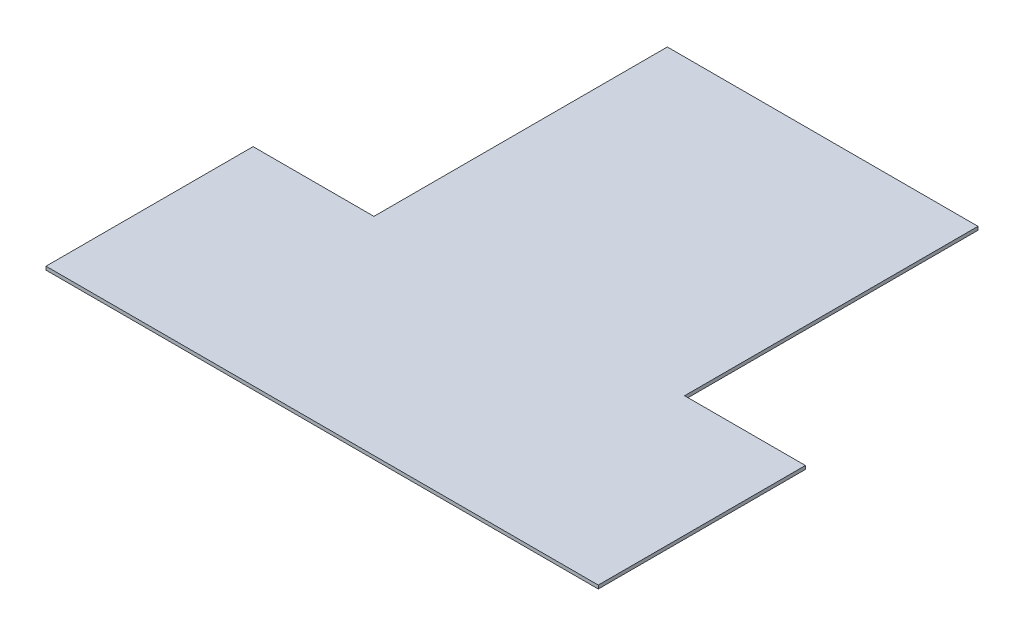
ISO-10303-21;
HEADER;
FILE_DESCRIPTION(('STEP AP214'),'2;1');
FILE_NAME('part.step','',(''),(''),'','','');
FILE_SCHEMA(('AUTOMOTIVE_DESIGN { 1 0 10303 214 1 1 1 1 }'));
ENDSEC;
DATA;
#1=APPLICATION_CONTEXT('core data for automotive mechanical design processes');
#2=APPLICATION_PROTOCOL_DEFINITION('international standard','automotive_design',2000,#1);
#3=PRODUCT_CONTEXT('',#1,'mechanical');
#4=PRODUCT('Part','Part','',(#3));
#5=PRODUCT_RELATED_PRODUCT_CATEGORY('part','',(#4));
#6=PRODUCT_DEFINITION_FORMATION('','',#4);
#7=PRODUCT_DEFINITION_CONTEXT('part definition',#1,'design');
#8=PRODUCT_DEFINITION('design','',#6,#7);
#9=PRODUCT_DEFINITION_SHAPE('','',#8);
#10=(LENGTH_UNIT() NAMED_UNIT(*) SI_UNIT(.MILLI.,.METRE.));
#11=(NAMED_UNIT(*) PLANE_ANGLE_UNIT() SI_UNIT($,.RADIAN.));
#12=(NAMED_UNIT(*) SI_UNIT($,.STERADIAN.) SOLID_ANGLE_UNIT());
#13=UNCERTAINTY_MEASURE_WITH_UNIT(LENGTH_MEASURE(1.E-05),#10,'distance_accuracy_value','');
#14=(GEOMETRIC_REPRESENTATION_CONTEXT(3) GLOBAL_UNCERTAINTY_ASSIGNED_CONTEXT((#13)) GLOBAL_UNIT_ASSIGNED_CONTEXT((#10,
#11,#12)) REPRESENTATION_CONTEXT('',''));
#15=CARTESIAN_POINT('',(0.,0.,0.));
#16=DIRECTION('',(0.,0.,1.));
#17=DIRECTION('',(1.,0.,0.));
#18=AXIS2_PLACEMENT_3D('',#15,#16,#17);
#19=CARTESIAN_POINT('',(-134.896932201657,2.54,156.777680579184));
#20=DIRECTION('',(0.,0.,1.));
#21=DIRECTION('',(1.,0.,0.));
#22=AXIS2_PLACEMENT_3D('',#19,#20,#21);
#23=PLANE('',#22);
#24=DIRECTION('',(-1.,0.,0.));
#25=VECTOR('',#24,1.);
#26=CARTESIAN_POINT('',(-134.896932201657,0.,156.777680579184));
#27=LINE('',#26,#25);
#28=CARTESIAN_POINT('',(-45.9969322016566,0.,156.777680579184));
#29=VERTEX_POINT('',#28);
#30=CARTESIAN_POINT('',(-134.896932201657,0.,156.777680579184));
#31=VERTEX_POINT('',#30);
#32=EDGE_CURVE('E127',#29,#31,#27,.T.);
#33=ORIENTED_EDGE('',*,*,#32,.T.);
#34=DIRECTION('',(0.,-1.,0.));
#35=VECTOR('',#34,1.);
#36=CARTESIAN_POINT('',(-134.896932201657,2.54,156.777680579184));
#37=LINE('',#36,#35);
#38=CARTESIAN_POINT('',(-134.896932201657,2.54,156.777680579184));
#39=VERTEX_POINT('',#38);
#40=EDGE_CURVE('E11',#39,#31,#37,.T.);
#41=ORIENTED_EDGE('',*,*,#40,.F.);
#42=DIRECTION('',(-1.,0.,0.));
#43=VECTOR('',#42,1.);
#44=CARTESIAN_POINT('',(-134.896932201657,2.54,156.777680579184));
#45=LINE('',#44,#43);
#46=CARTESIAN_POINT('',(-45.9969322016566,2.54,156.777680579184));
#47=VERTEX_POINT('',#46);
#48=EDGE_CURVE('E141',#47,#39,#45,.T.);
#49=ORIENTED_EDGE('',*,*,#48,.F.);
#50=DIRECTION('',(0.,-1.,0.));
#51=VECTOR('',#50,1.);
#52=CARTESIAN_POINT('',(-45.9969322016566,2.54,156.777680579184));
#53=LINE('',#52,#51);
#54=EDGE_CURVE('E123',#47,#29,#53,.T.);
#55=ORIENTED_EDGE('',*,*,#54,.T.);
#56=EDGE_LOOP('',(#33,#41,#49,#55));
#57=FACE_BOUND('',#56,.T.);
#58=ADVANCED_FACE('F31',(#57),#23,.F.);
#59=CARTESIAN_POINT('',(-134.896932201657,2.54,309.177680579184));
#60=DIRECTION('',(1.,0.,0.));
#61=DIRECTION('',(0.,0.,-1.));
#62=AXIS2_PLACEMENT_3D('',#59,#60,#61);
#63=PLANE('',#62);
#64=DIRECTION('',(0.,0.,1.));
#65=VECTOR('',#64,1.);
#66=CARTESIAN_POINT('',(-134.896932201657,0.,309.177680579184));
#67=LINE('',#66,#65);
#68=CARTESIAN_POINT('',(-134.896932201657,0.,309.177680579184));
#69=VERTEX_POINT('',#68);
#70=EDGE_CURVE('E130',#31,#69,#67,.T.);
#71=ORIENTED_EDGE('',*,*,#70,.T.);
#72=DIRECTION('',(0.,-1.,0.));
#73=VECTOR('',#72,1.);
#74=CARTESIAN_POINT('',(-134.896932201657,2.54,309.177680579184));
#75=LINE('',#74,#73);
#76=CARTESIAN_POINT('',(-134.896932201657,2.54,309.177680579184));
#77=VERTEX_POINT('',#76);
#78=EDGE_CURVE('E39',#77,#69,#75,.T.);
#79=ORIENTED_EDGE('',*,*,#78,.F.);
#80=DIRECTION('',(0.,0.,1.));
#81=VECTOR('',#80,1.);
#82=CARTESIAN_POINT('',(-134.896932201657,2.54,309.177680579184));
#83=LINE('',#82,#81);
#84=EDGE_CURVE('E90',#39,#77,#83,.T.);
#85=ORIENTED_EDGE('',*,*,#84,.F.);
#86=ORIENTED_EDGE('',*,*,#40,.T.);
#87=EDGE_LOOP('',(#71,#79,#85,#86));
#88=FACE_BOUND('',#87,.T.);
#89=ADVANCED_FACE('F176',(#88),#63,.F.);
#90=CARTESIAN_POINT('',(271.503067798343,2.54,309.177680579184));
#91=DIRECTION('',(0.,0.,-1.));
#92=DIRECTION('',(-1.,0.,0.));
#93=AXIS2_PLACEMENT_3D('',#90,#91,#92);
#94=PLANE('',#93);
#95=DIRECTION('',(1.,0.,0.));
#96=VECTOR('',#95,1.);
#97=CARTESIAN_POINT('',(271.503067798343,0.,309.177680579184));
#98=LINE('',#97,#96);
#99=CARTESIAN_POINT('',(271.503067798343,0.,309.177680579184));
#100=VERTEX_POINT('',#99);
#101=EDGE_CURVE('E132',#69,#100,#98,.T.);
#102=ORIENTED_EDGE('',*,*,#101,.T.);
#103=DIRECTION('',(0.,-1.,0.));
#104=VECTOR('',#103,1.);
#105=CARTESIAN_POINT('',(271.503067798343,2.54,309.177680579184));
#106=LINE('',#105,#104);
#107=CARTESIAN_POINT('',(271.503067798343,2.54,309.177680579184));
#108=VERTEX_POINT('',#107);
#109=EDGE_CURVE('E148',#108,#100,#106,.T.);
#110=ORIENTED_EDGE('',*,*,#109,.F.);
#111=DIRECTION('',(1.,0.,0.));
#112=VECTOR('',#111,1.);
#113=CARTESIAN_POINT('',(271.503067798343,2.54,309.177680579184));
#114=LINE('',#113,#112);
#115=EDGE_CURVE('E156',#77,#108,#114,.T.);
#116=ORIENTED_EDGE('',*,*,#115,.F.);
#117=ORIENTED_EDGE('',*,*,#78,.T.);
#118=EDGE_LOOP('',(#102,#110,#116,#117));
#119=FACE_BOUND('',#118,.T.);
#120=ADVANCED_FACE('F154',(#119),#94,.F.);
#121=CARTESIAN_POINT('',(271.503067798343,2.54,156.777680579184));
#122=DIRECTION('',(-1.,0.,0.));
#123=DIRECTION('',(0.,0.,1.));
#124=AXIS2_PLACEMENT_3D('',#121,#122,#123);
#125=PLANE('',#124);
#126=DIRECTION('',(0.,0.,-1.));
#127=VECTOR('',#126,1.);
#128=CARTESIAN_POINT('',(271.503067798343,0.,156.777680579184));
#129=LINE('',#128,#127);
#130=CARTESIAN_POINT('',(271.503067798343,0.,156.777680579184));
#131=VERTEX_POINT('',#130);
#132=EDGE_CURVE('E134',#100,#131,#129,.T.);
#133=ORIENTED_EDGE('',*,*,#132,.T.);
#134=DIRECTION('',(0.,-1.,0.));
#135=VECTOR('',#134,1.);
#136=CARTESIAN_POINT('',(271.503067798343,2.54,156.777680579184));
#137=LINE('',#136,#135);
#138=CARTESIAN_POINT('',(271.503067798343,2.54,156.777680579184));
#139=VERTEX_POINT('',#138);
#140=EDGE_CURVE('E145',#139,#131,#137,.T.);
#141=ORIENTED_EDGE('',*,*,#140,.F.);
#142=DIRECTION('',(0.,0.,-1.));
#143=VECTOR('',#142,1.);
#144=CARTESIAN_POINT('',(271.503067798343,2.54,156.777680579184));
#145=LINE('',#144,#143);
#146=EDGE_CURVE('E168',#108,#139,#145,.T.);
#147=ORIENTED_EDGE('',*,*,#146,.F.);
#148=ORIENTED_EDGE('',*,*,#109,.T.);
#149=EDGE_LOOP('',(#133,#141,#147,#148));
#150=FACE_BOUND('',#149,.T.);
#151=ADVANCED_FACE('F164',(#150),#125,.F.);
#152=CARTESIAN_POINT('',(182.603067798343,2.54,156.777680579184));
#153=DIRECTION('',(0.,0.,1.));
#154=DIRECTION('',(1.,0.,0.));
#155=AXIS2_PLACEMENT_3D('',#152,#153,#154);
#156=PLANE('',#155);
#157=DIRECTION('',(-1.,0.,0.));
#158=VECTOR('',#157,1.);
#159=CARTESIAN_POINT('',(182.603067798343,0.,156.777680579184));
#160=LINE('',#159,#158);
#161=CARTESIAN_POINT('',(182.603067798343,0.,156.777680579184));
#162=VERTEX_POINT('',#161);
#163=EDGE_CURVE('E136',#131,#162,#160,.T.);
#164=ORIENTED_EDGE('',*,*,#163,.T.);
#165=DIRECTION('',(0.,-1.,0.));
#166=VECTOR('',#165,1.);
#167=CARTESIAN_POINT('',(182.603067798343,2.54,156.777680579184));
#168=LINE('',#167,#166);
#169=CARTESIAN_POINT('',(182.603067798343,2.54,156.777680579184));
#170=VERTEX_POINT('',#169);
#171=EDGE_CURVE('E118',#170,#162,#168,.T.);
#172=ORIENTED_EDGE('',*,*,#171,.F.);
#173=DIRECTION('',(-1.,0.,0.));
#174=VECTOR('',#173,1.);
#175=CARTESIAN_POINT('',(182.603067798343,2.54,156.777680579184));
#176=LINE('',#175,#174);
#177=EDGE_CURVE('E109',#139,#170,#176,.T.);
#178=ORIENTED_EDGE('',*,*,#177,.F.);
#179=ORIENTED_EDGE('',*,*,#140,.T.);
#180=EDGE_LOOP('',(#164,#172,#178,#179));
#181=FACE_BOUND('',#180,.T.);
#182=ADVANCED_FACE('F167',(#181),#156,.F.);
#183=CARTESIAN_POINT('',(182.603067798343,2.54,-59.1223194208162));
#184=DIRECTION('',(-1.,0.,0.));
#185=DIRECTION('',(0.,0.,1.));
#186=AXIS2_PLACEMENT_3D('',#183,#184,#185);
#187=PLANE('',#186);
#188=DIRECTION('',(0.,0.,-1.));
#189=VECTOR('',#188,1.);
#190=CARTESIAN_POINT('',(182.603067798343,0.,-59.1223194208162));
#191=LINE('',#190,#189);
#192=CARTESIAN_POINT('',(182.603067798343,0.,-59.1223194208162));
#193=VERTEX_POINT('',#192);
#194=EDGE_CURVE('E117',#162,#193,#191,.T.);
#195=ORIENTED_EDGE('',*,*,#194,.T.);
#196=DIRECTION('',(0.,-1.,0.));
#197=VECTOR('',#196,1.);
#198=CARTESIAN_POINT('',(182.603067798343,2.54,-59.1223194208162));
#199=LINE('',#198,#197);
#200=CARTESIAN_POINT('',(182.603067798343,2.54,-59.1223194208162));
#201=VERTEX_POINT('',#200);
#202=EDGE_CURVE('E114',#201,#193,#199,.T.);
#203=ORIENTED_EDGE('',*,*,#202,.F.);
#204=DIRECTION('',(0.,0.,-1.));
#205=VECTOR('',#204,1.);
#206=CARTESIAN_POINT('',(182.603067798343,2.54,-59.1223194208162));
#207=LINE('',#206,#205);
#208=EDGE_CURVE('E103',#170,#201,#207,.T.);
#209=ORIENTED_EDGE('',*,*,#208,.F.);
#210=ORIENTED_EDGE('',*,*,#171,.T.);
#211=EDGE_LOOP('',(#195,#203,#209,#210));
#212=FACE_BOUND('',#211,.T.);
#213=ADVANCED_FACE('F115',(#212),#187,.F.);
#214=CARTESIAN_POINT('',(-45.9969322016566,2.54,-59.1223194208162));
#215=DIRECTION('',(0.,0.,1.));
#216=DIRECTION('',(1.,0.,0.));
#217=AXIS2_PLACEMENT_3D('',#214,#215,#216);
#218=PLANE('',#217);
#219=DIRECTION('',(-1.,0.,0.));
#220=VECTOR('',#219,1.);
#221=CARTESIAN_POINT('',(-45.9969322016566,0.,-59.1223194208162));
#222=LINE('',#221,#220);
#223=CARTESIAN_POINT('',(-45.9969322016566,0.,-59.1223194208162));
#224=VERTEX_POINT('',#223);
#225=EDGE_CURVE('E76',#193,#224,#222,.T.);
#226=ORIENTED_EDGE('',*,*,#225,.T.);
#227=DIRECTION('',(0.,-1.,0.));
#228=VECTOR('',#227,1.);
#229=CARTESIAN_POINT('',(-45.9969322016566,2.54,-59.1223194208162));
#230=LINE('',#229,#228);
#231=CARTESIAN_POINT('',(-45.9969322016566,2.54,-59.1223194208162));
#232=VERTEX_POINT('',#231);
#233=EDGE_CURVE('E119',#232,#224,#230,.T.);
#234=ORIENTED_EDGE('',*,*,#233,.F.);
#235=DIRECTION('',(-1.,0.,0.));
#236=VECTOR('',#235,1.);
#237=CARTESIAN_POINT('',(-45.9969322016566,2.54,-59.1223194208162));
#238=LINE('',#237,#236);
#239=EDGE_CURVE('E107',#201,#232,#238,.T.);
#240=ORIENTED_EDGE('',*,*,#239,.F.);
#241=ORIENTED_EDGE('',*,*,#202,.T.);
#242=EDGE_LOOP('',(#226,#234,#240,#241));
#243=FACE_BOUND('',#242,.T.);
#244=ADVANCED_FACE('F121',(#243),#218,.F.);
#245=CARTESIAN_POINT('',(-45.9969322016566,2.54,156.777680579184));
#246=DIRECTION('',(1.,0.,0.));
#247=DIRECTION('',(0.,0.,-1.));
#248=AXIS2_PLACEMENT_3D('',#245,#246,#247);
#249=PLANE('',#248);
#250=DIRECTION('',(0.,0.,1.));
#251=VECTOR('',#250,1.);
#252=CARTESIAN_POINT('',(-45.9969322016566,0.,156.777680579184));
#253=LINE('',#252,#251);
#254=EDGE_CURVE('E82',#224,#29,#253,.T.);
#255=ORIENTED_EDGE('',*,*,#254,.T.);
#256=ORIENTED_EDGE('',*,*,#54,.F.);
#257=DIRECTION('',(0.,0.,1.));
#258=VECTOR('',#257,1.);
#259=CARTESIAN_POINT('',(-45.9969322016566,2.54,156.777680579184));
#260=LINE('',#259,#258);
#261=EDGE_CURVE('E47',#232,#47,#260,.T.);
#262=ORIENTED_EDGE('',*,*,#261,.F.);
#263=ORIENTED_EDGE('',*,*,#233,.T.);
#264=EDGE_LOOP('',(#255,#256,#262,#263));
#265=FACE_BOUND('',#264,.T.);
#266=ADVANCED_FACE('F192',(#265),#249,.F.);
#267=CARTESIAN_POINT('',(-45.9969322016566,2.54,156.777680579184));
#268=DIRECTION('',(0.,1.,0.));
#269=DIRECTION('',(0.,0.,1.));
#270=AXIS2_PLACEMENT_3D('',#267,#268,#269);
#271=PLANE('',#270);
#272=ORIENTED_EDGE('',*,*,#48,.T.);
#273=ORIENTED_EDGE('',*,*,#84,.T.);
#274=ORIENTED_EDGE('',*,*,#115,.T.);
#275=ORIENTED_EDGE('',*,*,#146,.T.);
#276=ORIENTED_EDGE('',*,*,#177,.T.);
#277=ORIENTED_EDGE('',*,*,#208,.T.);
#278=ORIENTED_EDGE('',*,*,#239,.T.);
#279=ORIENTED_EDGE('',*,*,#261,.T.);
#280=EDGE_LOOP('',(#272,#273,#274,#275,#276,#277,#278,#279));
#281=FACE_BOUND('',#280,.T.);
#282=ADVANCED_FACE('F105',(#281),#271,.T.);
#283=CARTESIAN_POINT('',(-45.9969322016566,0.,156.777680579184));
#284=DIRECTION('',(0.,1.,0.));
#285=DIRECTION('',(0.,0.,1.));
#286=AXIS2_PLACEMENT_3D('',#283,#284,#285);
#287=PLANE('',#286);
#288=ORIENTED_EDGE('',*,*,#32,.F.);
#289=ORIENTED_EDGE('',*,*,#254,.F.);
#290=ORIENTED_EDGE('',*,*,#225,.F.);
#291=ORIENTED_EDGE('',*,*,#194,.F.);
#292=ORIENTED_EDGE('',*,*,#163,.F.);
#293=ORIENTED_EDGE('',*,*,#132,.F.);
#294=ORIENTED_EDGE('',*,*,#101,.F.);
#295=ORIENTED_EDGE('',*,*,#70,.F.);
#296=EDGE_LOOP('',(#288,#289,#290,#291,#292,#293,#294,#295));
#297=FACE_BOUND('',#296,.T.);
#298=ADVANCED_FACE('F160',(#297),#287,.F.);
#299=CLOSED_SHELL('',(#58,#89,#120,#151,#182,#213,#244,#266,#282,#298));
#300=MANIFOLD_SOLID_BREP('B2',#299);
#301=ADVANCED_BREP_SHAPE_REPRESENTATION('',(#18,#300),#14);
#302=SHAPE_DEFINITION_REPRESENTATION(#9,#301);
ENDSEC;
END-ISO-10303-21;
